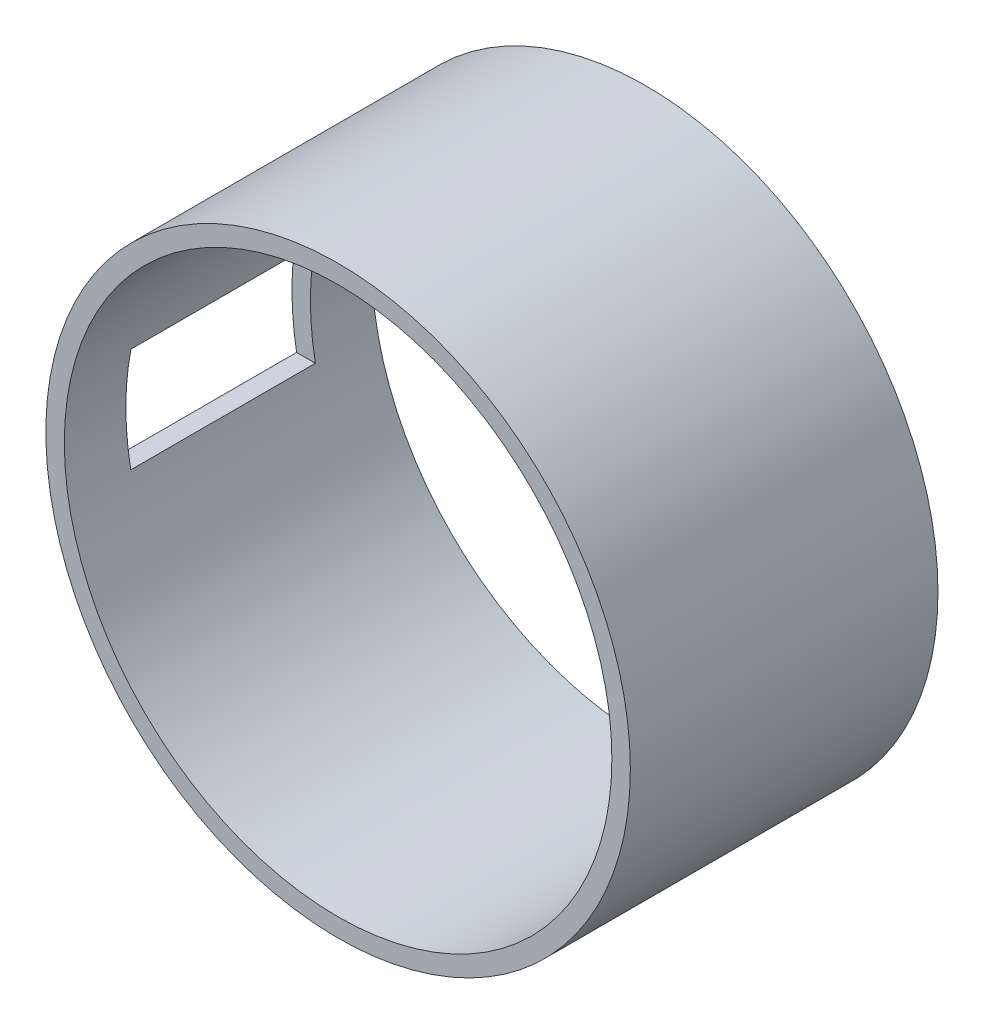
ISO-10303-21;
HEADER;
FILE_DESCRIPTION(('STEP AP214'),'2;1');
FILE_NAME('part.step','',(''),(''),'','','');
FILE_SCHEMA(('AUTOMOTIVE_DESIGN { 1 0 10303 214 1 1 1 1 }'));
ENDSEC;
DATA;
#1=APPLICATION_CONTEXT('core data for automotive mechanical design processes');
#2=APPLICATION_PROTOCOL_DEFINITION('international standard','automotive_design',2000,#1);
#3=PRODUCT_CONTEXT('',#1,'mechanical');
#4=PRODUCT('Part','Part','',(#3));
#5=PRODUCT_RELATED_PRODUCT_CATEGORY('part','',(#4));
#6=PRODUCT_DEFINITION_FORMATION('','',#4);
#7=PRODUCT_DEFINITION_CONTEXT('part definition',#1,'design');
#8=PRODUCT_DEFINITION('design','',#6,#7);
#9=PRODUCT_DEFINITION_SHAPE('','',#8);
#10=(LENGTH_UNIT() NAMED_UNIT(*) SI_UNIT(.MILLI.,.METRE.));
#11=(NAMED_UNIT(*) PLANE_ANGLE_UNIT() SI_UNIT($,.RADIAN.));
#12=(NAMED_UNIT(*) SI_UNIT($,.STERADIAN.) SOLID_ANGLE_UNIT());
#13=UNCERTAINTY_MEASURE_WITH_UNIT(LENGTH_MEASURE(1.E-05),#10,'distance_accuracy_value','');
#14=(GEOMETRIC_REPRESENTATION_CONTEXT(3) GLOBAL_UNCERTAINTY_ASSIGNED_CONTEXT((#13)) GLOBAL_UNIT_ASSIGNED_CONTEXT((#10,
#11,#12)) REPRESENTATION_CONTEXT('',''));
#15=CARTESIAN_POINT('',(0.,0.,0.));
#16=DIRECTION('',(0.,0.,1.));
#17=DIRECTION('',(1.,0.,0.));
#18=AXIS2_PLACEMENT_3D('',#15,#16,#17);
#19=CARTESIAN_POINT('',(0.,0.,10.));
#20=DIRECTION('',(0.,0.,1.));
#21=DIRECTION('',(1.,0.,0.));
#22=AXIS2_PLACEMENT_3D('',#19,#20,#21);
#23=PLANE('',#22);
#24=CARTESIAN_POINT('',(0.,0.,10.));
#25=DIRECTION('',(0.,0.,1.));
#26=DIRECTION('',(1.,0.,0.));
#27=AXIS2_PLACEMENT_3D('',#24,#25,#26);
#28=CIRCLE('',#27,9.5);
#29=CARTESIAN_POINT('',(9.5,0.,10.));
#30=VERTEX_POINT('',#29);
#31=EDGE_CURVE('E91',#30,#30,#28,.T.);
#32=ORIENTED_EDGE('',*,*,#31,.T.);
#33=EDGE_LOOP('',(#32));
#34=FACE_BOUND('',#33,.T.);
#35=CARTESIAN_POINT('',(0.,0.,10.));
#36=DIRECTION('',(0.,0.,1.));
#37=DIRECTION('',(1.,0.,0.));
#38=AXIS2_PLACEMENT_3D('',#35,#36,#37);
#39=CIRCLE('',#38,8.9);
#40=CARTESIAN_POINT('',(8.9,0.,10.));
#41=VERTEX_POINT('',#40);
#42=EDGE_CURVE('E115',#41,#41,#39,.T.);
#43=ORIENTED_EDGE('',*,*,#42,.F.);
#44=EDGE_LOOP('',(#43));
#45=FACE_BOUND('',#44,.T.);
#46=ADVANCED_FACE('F45',(#34,#45),#23,.T.);
#47=CARTESIAN_POINT('',(0.,0.,0.));
#48=DIRECTION('',(0.,0.,1.));
#49=DIRECTION('',(1.,0.,0.));
#50=AXIS2_PLACEMENT_3D('',#47,#48,#49);
#51=PLANE('',#50);
#52=CARTESIAN_POINT('',(0.,0.,0.));
#53=DIRECTION('',(0.,0.,1.));
#54=DIRECTION('',(1.,0.,0.));
#55=AXIS2_PLACEMENT_3D('',#52,#53,#54);
#56=CIRCLE('',#55,9.5);
#57=CARTESIAN_POINT('',(9.5,0.,0.));
#58=VERTEX_POINT('',#57);
#59=EDGE_CURVE('E111',#58,#58,#56,.T.);
#60=ORIENTED_EDGE('',*,*,#59,.F.);
#61=EDGE_LOOP('',(#60));
#62=FACE_BOUND('',#61,.T.);
#63=CARTESIAN_POINT('',(0.,0.,0.));
#64=DIRECTION('',(0.,0.,1.));
#65=DIRECTION('',(1.,0.,0.));
#66=AXIS2_PLACEMENT_3D('',#63,#64,#65);
#67=CIRCLE('',#66,8.9);
#68=CARTESIAN_POINT('',(8.9,0.,0.));
#69=VERTEX_POINT('',#68);
#70=EDGE_CURVE('E119',#69,#69,#67,.T.);
#71=ORIENTED_EDGE('',*,*,#70,.T.);
#72=EDGE_LOOP('',(#71));
#73=FACE_BOUND('',#72,.T.);
#74=ADVANCED_FACE('F160',(#62,#73),#51,.F.);
#75=CARTESIAN_POINT('',(0.,0.,10.));
#76=DIRECTION('',(0.,0.,-1.));
#77=DIRECTION('',(-1.,0.,0.));
#78=AXIS2_PLACEMENT_3D('',#75,#76,#77);
#79=CYLINDRICAL_SURFACE('',#78,9.5);
#80=DIRECTION('',(0.,0.,-1.));
#81=VECTOR('',#80,1.);
#82=CARTESIAN_POINT('',(-9.34394553728158,1.71484162426612,10.));
#83=LINE('',#82,#81);
#84=CARTESIAN_POINT('',(-9.34394553728158,1.71484162426612,2.));
#85=VERTEX_POINT('',#84);
#86=CARTESIAN_POINT('',(-9.34394553728158,1.71484162426612,8.));
#87=VERTEX_POINT('',#86);
#88=EDGE_CURVE('E128',#85,#87,#83,.F.);
#89=ORIENTED_EDGE('',*,*,#88,.T.);
#90=CARTESIAN_POINT('',(0.,0.,8.));
#91=DIRECTION('',(0.,0.,1.));
#92=DIRECTION('',(1.,0.,0.));
#93=AXIS2_PLACEMENT_3D('',#90,#91,#92);
#94=CIRCLE('',#93,9.5);
#95=CARTESIAN_POINT('',(-9.34934442881927,-1.68515837573388,8.));
#96=VERTEX_POINT('',#95);
#97=EDGE_CURVE('E132',#87,#96,#94,.T.);
#98=ORIENTED_EDGE('',*,*,#97,.T.);
#99=DIRECTION('',(0.,0.,-1.));
#100=VECTOR('',#99,1.);
#101=CARTESIAN_POINT('',(-9.34934442881927,-1.68515837573388,10.));
#102=LINE('',#101,#100);
#103=CARTESIAN_POINT('',(-9.34934442881927,-1.68515837573388,2.));
#104=VERTEX_POINT('',#103);
#105=EDGE_CURVE('E135',#96,#104,#102,.T.);
#106=ORIENTED_EDGE('',*,*,#105,.T.);
#107=CARTESIAN_POINT('',(0.,0.,2.));
#108=DIRECTION('',(0.,0.,-1.));
#109=DIRECTION('',(0.,1.,0.));
#110=AXIS2_PLACEMENT_3D('',#107,#108,#109);
#111=CIRCLE('',#110,9.5);
#112=EDGE_CURVE('E97',#104,#85,#111,.T.);
#113=ORIENTED_EDGE('',*,*,#112,.T.);
#114=EDGE_LOOP('',(#89,#98,#106,#113));
#115=FACE_BOUND('',#114,.T.);
#116=ORIENTED_EDGE('',*,*,#31,.F.);
#117=EDGE_LOOP('',(#116));
#118=FACE_BOUND('',#117,.T.);
#119=ORIENTED_EDGE('',*,*,#59,.T.);
#120=EDGE_LOOP('',(#119));
#121=FACE_BOUND('',#120,.T.);
#122=ADVANCED_FACE('F47',(#115,#118,#121),#79,.T.);
#123=CARTESIAN_POINT('',(0.,0.,10.));
#124=DIRECTION('',(0.,0.,-1.));
#125=DIRECTION('',(-1.,0.,0.));
#126=AXIS2_PLACEMENT_3D('',#123,#124,#125);
#127=CYLINDRICAL_SURFACE('',#126,8.9);
#128=CARTESIAN_POINT('',(0.,0.,2.));
#129=DIRECTION('',(0.,0.,-1.));
#130=DIRECTION('',(0.,1.,0.));
#131=AXIS2_PLACEMENT_3D('',#128,#129,#130);
#132=CIRCLE('',#131,8.9);
#133=CARTESIAN_POINT('',(-8.73900688000038,-1.68515837573388,2.));
#134=VERTEX_POINT('',#133);
#135=CARTESIAN_POINT('',(-8.73323068535833,1.71484162426612,2.));
#136=VERTEX_POINT('',#135);
#137=EDGE_CURVE('E11',#134,#136,#132,.T.);
#138=ORIENTED_EDGE('',*,*,#137,.F.);
#139=DIRECTION('',(0.,0.,-1.));
#140=VECTOR('',#139,1.);
#141=CARTESIAN_POINT('',(-8.73900688000038,-1.68515837573388,10.));
#142=LINE('',#141,#140);
#143=CARTESIAN_POINT('',(-8.73900688000038,-1.68515837573388,8.));
#144=VERTEX_POINT('',#143);
#145=EDGE_CURVE('E84',#144,#134,#142,.T.);
#146=ORIENTED_EDGE('',*,*,#145,.F.);
#147=CARTESIAN_POINT('',(0.,0.,8.));
#148=DIRECTION('',(0.,0.,1.));
#149=DIRECTION('',(1.,0.,0.));
#150=AXIS2_PLACEMENT_3D('',#147,#148,#149);
#151=CIRCLE('',#150,8.9);
#152=CARTESIAN_POINT('',(-8.73323068535833,1.71484162426612,8.));
#153=VERTEX_POINT('',#152);
#154=EDGE_CURVE('E90',#153,#144,#151,.T.);
#155=ORIENTED_EDGE('',*,*,#154,.F.);
#156=DIRECTION('',(0.,0.,-1.));
#157=VECTOR('',#156,1.);
#158=CARTESIAN_POINT('',(-8.73323068535833,1.71484162426612,10.));
#159=LINE('',#158,#157);
#160=EDGE_CURVE('E54',#136,#153,#159,.F.);
#161=ORIENTED_EDGE('',*,*,#160,.F.);
#162=EDGE_LOOP('',(#138,#146,#155,#161));
#163=FACE_BOUND('',#162,.T.);
#164=ORIENTED_EDGE('',*,*,#42,.T.);
#165=EDGE_LOOP('',(#164));
#166=FACE_BOUND('',#165,.T.);
#167=ORIENTED_EDGE('',*,*,#70,.F.);
#168=EDGE_LOOP('',(#167));
#169=FACE_BOUND('',#168,.T.);
#170=ADVANCED_FACE('F102',(#163,#166,#169),#127,.F.);
#171=CARTESIAN_POINT('',(-8.,1.71484162426612,2.));
#172=DIRECTION('',(0.,0.,-1.));
#173=DIRECTION('',(0.,1.,0.));
#174=AXIS2_PLACEMENT_3D('',#171,#172,#173);
#175=PLANE('',#174);
#176=DIRECTION('',(-1.,0.,0.));
#177=VECTOR('',#176,1.);
#178=CARTESIAN_POINT('',(-8.,-1.68515837573388,2.));
#179=LINE('',#178,#177);
#180=EDGE_CURVE('E61',#134,#104,#179,.T.);
#181=ORIENTED_EDGE('',*,*,#180,.F.);
#182=ORIENTED_EDGE('',*,*,#137,.T.);
#183=DIRECTION('',(-1.,0.,0.));
#184=VECTOR('',#183,1.);
#185=CARTESIAN_POINT('',(-8.,1.71484162426612,2.));
#186=LINE('',#185,#184);
#187=EDGE_CURVE('E137',#136,#85,#186,.T.);
#188=ORIENTED_EDGE('',*,*,#187,.T.);
#189=ORIENTED_EDGE('',*,*,#112,.F.);
#190=EDGE_LOOP('',(#181,#182,#188,#189));
#191=FACE_BOUND('',#190,.T.);
#192=ADVANCED_FACE('F94',(#191),#175,.F.);
#193=CARTESIAN_POINT('',(-8.,1.71484162426612,2.));
#194=DIRECTION('',(0.,1.,0.));
#195=DIRECTION('',(0.,0.,1.));
#196=AXIS2_PLACEMENT_3D('',#193,#194,#195);
#197=PLANE('',#196);
#198=ORIENTED_EDGE('',*,*,#187,.F.);
#199=ORIENTED_EDGE('',*,*,#160,.T.);
#200=DIRECTION('',(-1.,0.,0.));
#201=VECTOR('',#200,1.);
#202=CARTESIAN_POINT('',(-8.,1.71484162426612,8.));
#203=LINE('',#202,#201);
#204=EDGE_CURVE('E141',#153,#87,#203,.T.);
#205=ORIENTED_EDGE('',*,*,#204,.T.);
#206=ORIENTED_EDGE('',*,*,#88,.F.);
#207=EDGE_LOOP('',(#198,#199,#205,#206));
#208=FACE_BOUND('',#207,.T.);
#209=ADVANCED_FACE('F146',(#208),#197,.F.);
#210=CARTESIAN_POINT('',(-8.,1.71484162426612,8.));
#211=DIRECTION('',(0.,0.,1.));
#212=DIRECTION('',(1.,0.,0.));
#213=AXIS2_PLACEMENT_3D('',#210,#211,#212);
#214=PLANE('',#213);
#215=ORIENTED_EDGE('',*,*,#204,.F.);
#216=ORIENTED_EDGE('',*,*,#154,.T.);
#217=DIRECTION('',(-1.,0.,0.));
#218=VECTOR('',#217,1.);
#219=CARTESIAN_POINT('',(-8.,-1.68515837573388,8.));
#220=LINE('',#219,#218);
#221=EDGE_CURVE('E66',#144,#96,#220,.T.);
#222=ORIENTED_EDGE('',*,*,#221,.T.);
#223=ORIENTED_EDGE('',*,*,#97,.F.);
#224=EDGE_LOOP('',(#215,#216,#222,#223));
#225=FACE_BOUND('',#224,.T.);
#226=ADVANCED_FACE('F150',(#225),#214,.F.);
#227=CARTESIAN_POINT('',(-8.,-1.68515837573388,2.));
#228=DIRECTION('',(0.,-1.,0.));
#229=DIRECTION('',(0.,0.,-1.));
#230=AXIS2_PLACEMENT_3D('',#227,#228,#229);
#231=PLANE('',#230);
#232=ORIENTED_EDGE('',*,*,#221,.F.);
#233=ORIENTED_EDGE('',*,*,#145,.T.);
#234=ORIENTED_EDGE('',*,*,#180,.T.);
#235=ORIENTED_EDGE('',*,*,#105,.F.);
#236=EDGE_LOOP('',(#232,#233,#234,#235));
#237=FACE_BOUND('',#236,.T.);
#238=ADVANCED_FACE('F85',(#237),#231,.F.);
#239=CLOSED_SHELL('',(#46,#74,#122,#170,#192,#209,#226,#238));
#240=MANIFOLD_SOLID_BREP('B2',#239);
#241=ADVANCED_BREP_SHAPE_REPRESENTATION('',(#18,#240),#14);
#242=SHAPE_DEFINITION_REPRESENTATION(#9,#241);
ENDSEC;
END-ISO-10303-21;
